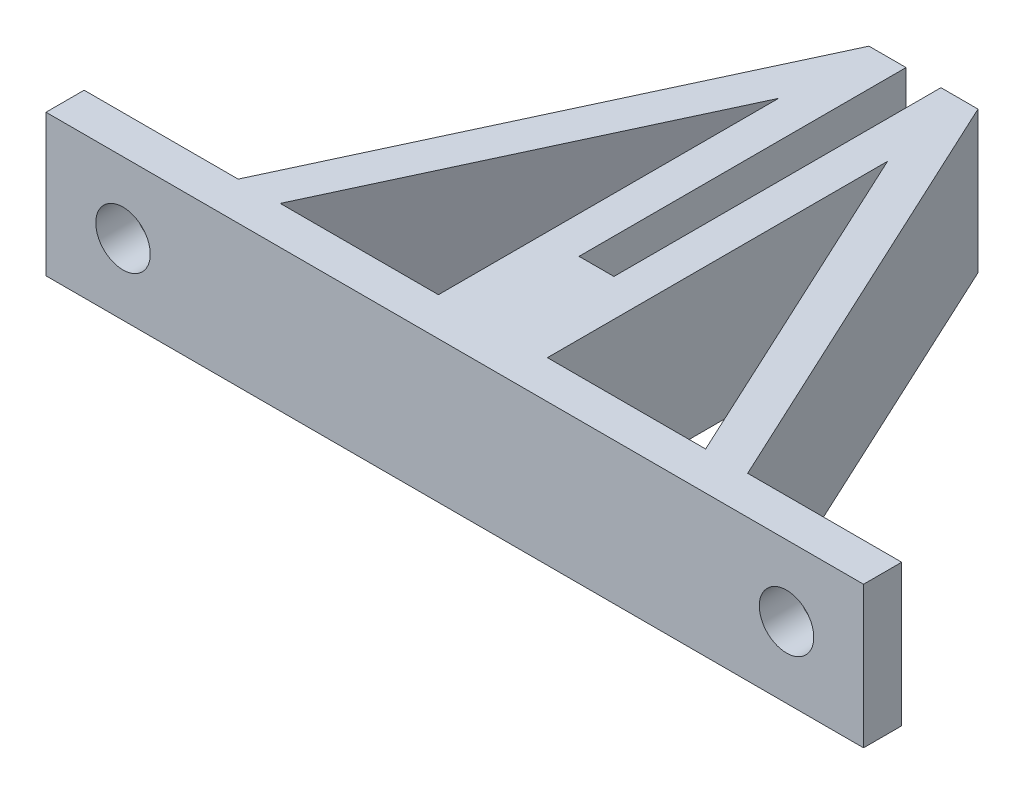
ISO-10303-21;
HEADER;
FILE_DESCRIPTION(('STEP AP214'),'2;1');
FILE_NAME('part.step','',(''),(''),'','','');
FILE_SCHEMA(('AUTOMOTIVE_DESIGN { 1 0 10303 214 1 1 1 1 }'));
ENDSEC;
DATA;
#1=APPLICATION_CONTEXT('core data for automotive mechanical design processes');
#2=APPLICATION_PROTOCOL_DEFINITION('international standard','automotive_design',2000,#1);
#3=PRODUCT_CONTEXT('',#1,'mechanical');
#4=PRODUCT('Part','Part','',(#3));
#5=PRODUCT_RELATED_PRODUCT_CATEGORY('part','',(#4));
#6=PRODUCT_DEFINITION_FORMATION('','',#4);
#7=PRODUCT_DEFINITION_CONTEXT('part definition',#1,'design');
#8=PRODUCT_DEFINITION('design','',#6,#7);
#9=PRODUCT_DEFINITION_SHAPE('','',#8);
#10=(LENGTH_UNIT() NAMED_UNIT(*) SI_UNIT(.MILLI.,.METRE.));
#11=(NAMED_UNIT(*) PLANE_ANGLE_UNIT() SI_UNIT($,.RADIAN.));
#12=(NAMED_UNIT(*) SI_UNIT($,.STERADIAN.) SOLID_ANGLE_UNIT());
#13=UNCERTAINTY_MEASURE_WITH_UNIT(LENGTH_MEASURE(1.E-05),#10,'distance_accuracy_value','');
#14=(GEOMETRIC_REPRESENTATION_CONTEXT(3) GLOBAL_UNCERTAINTY_ASSIGNED_CONTEXT((#13)) GLOBAL_UNIT_ASSIGNED_CONTEXT((#10,
#11,#12)) REPRESENTATION_CONTEXT('',''));
#15=CARTESIAN_POINT('',(0.,0.,0.));
#16=DIRECTION('',(0.,0.,1.));
#17=DIRECTION('',(1.,0.,0.));
#18=AXIS2_PLACEMENT_3D('',#15,#16,#17);
#19=CARTESIAN_POINT('',(-5.59907834101384,13.,0.));
#20=DIRECTION('',(1.,0.,0.));
#21=DIRECTION('',(0.,0.,-1.));
#22=AXIS2_PLACEMENT_3D('',#19,#20,#21);
#23=PLANE('',#22);
#24=DIRECTION('',(0.,0.,1.));
#25=VECTOR('',#24,1.);
#26=CARTESIAN_POINT('',(-5.59907834101384,0.,0.));
#27=LINE('',#26,#25);
#28=CARTESIAN_POINT('',(-5.59907834101385,0.,-7.22390748368882));
#29=VERTEX_POINT('',#28);
#30=CARTESIAN_POINT('',(-5.59907834101384,0.,23.9769585253456));
#31=VERTEX_POINT('',#30);
#32=EDGE_CURVE('E258',#29,#31,#27,.T.);
#33=ORIENTED_EDGE('',*,*,#32,.T.);
#34=DIRECTION('',(0.,-1.,0.));
#35=VECTOR('',#34,1.);
#36=CARTESIAN_POINT('',(-5.59907834101384,13.,23.9769585253456));
#37=LINE('',#36,#35);
#38=CARTESIAN_POINT('',(-5.59907834101384,13.,23.9769585253456));
#39=VERTEX_POINT('',#38);
#40=EDGE_CURVE('E11',#39,#31,#37,.T.);
#41=ORIENTED_EDGE('',*,*,#40,.F.);
#42=DIRECTION('',(0.,0.,1.));
#43=VECTOR('',#42,1.);
#44=CARTESIAN_POINT('',(-5.59907834101384,13.,0.));
#45=LINE('',#44,#43);
#46=CARTESIAN_POINT('',(-5.59907834101385,13.,-7.22390748368882));
#47=VERTEX_POINT('',#46);
#48=EDGE_CURVE('E223',#47,#39,#45,.T.);
#49=ORIENTED_EDGE('',*,*,#48,.F.);
#50=DIRECTION('',(0.,-1.,0.));
#51=VECTOR('',#50,1.);
#52=CARTESIAN_POINT('',(-5.59907834101385,13.,-7.22390748368882));
#53=LINE('',#52,#51);
#54=EDGE_CURVE('E261',#47,#29,#53,.T.);
#55=ORIENTED_EDGE('',*,*,#54,.T.);
#56=EDGE_LOOP('',(#33,#41,#49,#55));
#57=FACE_BOUND('',#56,.T.);
#58=ADVANCED_FACE('F35',(#57),#23,.F.);
#59=CARTESIAN_POINT('',(0.,13.,23.9769585253456));
#60=DIRECTION('',(0.,0.,-1.));
#61=DIRECTION('',(-1.,0.,0.));
#62=AXIS2_PLACEMENT_3D('',#59,#60,#61);
#63=PLANE('',#62);
#64=DIRECTION('',(1.,0.,0.));
#65=VECTOR('',#64,1.);
#66=CARTESIAN_POINT('',(0.,0.,23.9769585253456));
#67=LINE('',#66,#65);
#68=CARTESIAN_POINT('',(-20.1111090428903,0.,23.9769585253456));
#69=VERTEX_POINT('',#68);
#70=EDGE_CURVE('E182',#69,#31,#67,.T.);
#71=ORIENTED_EDGE('',*,*,#70,.F.);
#72=DIRECTION('',(0.,-1.,0.));
#73=VECTOR('',#72,1.);
#74=CARTESIAN_POINT('',(-20.1111090428903,13.,23.9769585253456));
#75=LINE('',#74,#73);
#76=CARTESIAN_POINT('',(-20.1111090428903,13.,23.9769585253456));
#77=VERTEX_POINT('',#76);
#78=EDGE_CURVE('E44',#77,#69,#75,.T.);
#79=ORIENTED_EDGE('',*,*,#78,.F.);
#80=DIRECTION('',(1.,0.,0.));
#81=VECTOR('',#80,1.);
#82=CARTESIAN_POINT('',(0.,13.,23.9769585253456));
#83=LINE('',#82,#81);
#84=EDGE_CURVE('E224',#77,#39,#83,.T.);
#85=ORIENTED_EDGE('',*,*,#84,.T.);
#86=ORIENTED_EDGE('',*,*,#40,.T.);
#87=EDGE_LOOP('',(#71,#79,#85,#86));
#88=FACE_BOUND('',#87,.T.);
#89=ADVANCED_FACE('F319',(#88),#63,.T.);
#90=CARTESIAN_POINT('',(-38.0990783410138,13.,0.));
#91=DIRECTION('',(-1.,0.,0.));
#92=DIRECTION('',(0.,0.,1.));
#93=AXIS2_PLACEMENT_3D('',#90,#91,#92);
#94=PLANE('',#93);
#95=DIRECTION('',(0.,0.,-1.));
#96=VECTOR('',#95,1.);
#97=CARTESIAN_POINT('',(-38.0990783410138,0.,0.));
#98=LINE('',#97,#96);
#99=CARTESIAN_POINT('',(-38.0990783410138,0.,27.4769585253456));
#100=VERTEX_POINT('',#99);
#101=CARTESIAN_POINT('',(-38.0990783410138,0.,23.9769585253456));
#102=VERTEX_POINT('',#101);
#103=EDGE_CURVE('E235',#100,#102,#98,.T.);
#104=ORIENTED_EDGE('',*,*,#103,.F.);
#105=DIRECTION('',(0.,-1.,0.));
#106=VECTOR('',#105,1.);
#107=CARTESIAN_POINT('',(-38.0990783410138,13.,27.4769585253456));
#108=LINE('',#107,#106);
#109=CARTESIAN_POINT('',(-38.0990783410138,13.,27.4769585253456));
#110=VERTEX_POINT('',#109);
#111=EDGE_CURVE('E264',#110,#100,#108,.T.);
#112=ORIENTED_EDGE('',*,*,#111,.F.);
#113=DIRECTION('',(0.,0.,-1.));
#114=VECTOR('',#113,1.);
#115=CARTESIAN_POINT('',(-38.0990783410138,13.,0.));
#116=LINE('',#115,#114);
#117=CARTESIAN_POINT('',(-38.0990783410138,13.,23.9769585253456));
#118=VERTEX_POINT('',#117);
#119=EDGE_CURVE('E189',#110,#118,#116,.T.);
#120=ORIENTED_EDGE('',*,*,#119,.T.);
#121=DIRECTION('',(0.,-1.,0.));
#122=VECTOR('',#121,1.);
#123=CARTESIAN_POINT('',(-38.0990783410138,13.,23.9769585253456));
#124=LINE('',#123,#122);
#125=EDGE_CURVE('E167',#118,#102,#124,.T.);
#126=ORIENTED_EDGE('',*,*,#125,.T.);
#127=EDGE_LOOP('',(#104,#112,#120,#126));
#128=FACE_BOUND('',#127,.T.);
#129=ADVANCED_FACE('F333',(#128),#94,.T.);
#130=CARTESIAN_POINT('',(0.,13.,27.4769585253456));
#131=DIRECTION('',(0.,0.,-1.));
#132=DIRECTION('',(-1.,0.,0.));
#133=AXIS2_PLACEMENT_3D('',#130,#131,#132);
#134=PLANE('',#133);
#135=CARTESIAN_POINT('',(29.8369681706141,6.5,27.4769585253456));
#136=DIRECTION('',(0.,0.,-1.));
#137=DIRECTION('',(-1.,0.,0.));
#138=AXIS2_PLACEMENT_3D('',#135,#136,#137);
#139=CIRCLE('',#138,2.5);
#140=CARTESIAN_POINT('',(27.3369681706141,6.5,27.4769585253456));
#141=VERTEX_POINT('',#140);
#142=EDGE_CURVE('E578',#141,#141,#139,.T.);
#143=ORIENTED_EDGE('',*,*,#142,.T.);
#144=EDGE_LOOP('',(#143));
#145=FACE_BOUND('',#144,.T.);
#146=CARTESIAN_POINT('',(-31.0351248526418,6.5,27.4769585253456));
#147=DIRECTION('',(0.,0.,-1.));
#148=DIRECTION('',(-1.,0.,0.));
#149=AXIS2_PLACEMENT_3D('',#146,#147,#148);
#150=CIRCLE('',#149,2.5);
#151=CARTESIAN_POINT('',(-33.5351248526418,6.5,27.4769585253456));
#152=VERTEX_POINT('',#151);
#153=EDGE_CURVE('E582',#152,#152,#150,.T.);
#154=ORIENTED_EDGE('',*,*,#153,.T.);
#155=EDGE_LOOP('',(#154));
#156=FACE_BOUND('',#155,.T.);
#157=DIRECTION('',(1.,0.,0.));
#158=VECTOR('',#157,1.);
#159=CARTESIAN_POINT('',(0.,0.,27.4769585253456));
#160=LINE('',#159,#158);
#161=CARTESIAN_POINT('',(36.9009216589862,0.,27.4769585253456));
#162=VERTEX_POINT('',#161);
#163=EDGE_CURVE('E238',#100,#162,#160,.T.);
#164=ORIENTED_EDGE('',*,*,#163,.T.);
#165=DIRECTION('',(0.,-1.,0.));
#166=VECTOR('',#165,1.);
#167=CARTESIAN_POINT('',(36.9009216589862,13.,27.4769585253456));
#168=LINE('',#167,#166);
#169=CARTESIAN_POINT('',(36.9009216589862,13.,27.4769585253456));
#170=VERTEX_POINT('',#169);
#171=EDGE_CURVE('E288',#170,#162,#168,.T.);
#172=ORIENTED_EDGE('',*,*,#171,.F.);
#173=DIRECTION('',(1.,0.,0.));
#174=VECTOR('',#173,1.);
#175=CARTESIAN_POINT('',(0.,13.,27.4769585253456));
#176=LINE('',#175,#174);
#177=EDGE_CURVE('E192',#110,#170,#176,.T.);
#178=ORIENTED_EDGE('',*,*,#177,.F.);
#179=ORIENTED_EDGE('',*,*,#111,.T.);
#180=EDGE_LOOP('',(#164,#172,#178,#179));
#181=FACE_BOUND('',#180,.T.);
#182=ADVANCED_FACE('F367',(#145,#156,#181),#134,.F.);
#183=CARTESIAN_POINT('',(36.9009216589862,13.,0.));
#184=DIRECTION('',(-1.,0.,0.));
#185=DIRECTION('',(0.,0.,1.));
#186=AXIS2_PLACEMENT_3D('',#183,#184,#185);
#187=PLANE('',#186);
#188=DIRECTION('',(0.,0.,-1.));
#189=VECTOR('',#188,1.);
#190=CARTESIAN_POINT('',(36.9009216589862,0.,0.));
#191=LINE('',#190,#189);
#192=CARTESIAN_POINT('',(36.9009216589862,0.,23.9769585253456));
#193=VERTEX_POINT('',#192);
#194=EDGE_CURVE('E241',#162,#193,#191,.T.);
#195=ORIENTED_EDGE('',*,*,#194,.T.);
#196=DIRECTION('',(0.,-1.,0.));
#197=VECTOR('',#196,1.);
#198=CARTESIAN_POINT('',(36.9009216589862,13.,23.9769585253456));
#199=LINE('',#198,#197);
#200=CARTESIAN_POINT('',(36.9009216589862,13.,23.9769585253456));
#201=VERTEX_POINT('',#200);
#202=EDGE_CURVE('E285',#201,#193,#199,.T.);
#203=ORIENTED_EDGE('',*,*,#202,.F.);
#204=DIRECTION('',(0.,0.,-1.));
#205=VECTOR('',#204,1.);
#206=CARTESIAN_POINT('',(36.9009216589862,13.,0.));
#207=LINE('',#206,#205);
#208=EDGE_CURVE('E195',#170,#201,#207,.T.);
#209=ORIENTED_EDGE('',*,*,#208,.F.);
#210=ORIENTED_EDGE('',*,*,#171,.T.);
#211=EDGE_LOOP('',(#195,#203,#209,#210));
#212=FACE_BOUND('',#211,.T.);
#213=ADVANCED_FACE('F363',(#212),#187,.F.);
#214=CARTESIAN_POINT('',(0.,13.,23.9769585253456));
#215=DIRECTION('',(0.,0.,1.));
#216=DIRECTION('',(1.,0.,0.));
#217=AXIS2_PLACEMENT_3D('',#214,#215,#216);
#218=PLANE('',#217);
#219=CARTESIAN_POINT('',(29.8369681706141,6.5,23.9769585253456));
#220=DIRECTION('',(0.,0.,-1.));
#221=DIRECTION('',(-1.,0.,0.));
#222=AXIS2_PLACEMENT_3D('',#219,#220,#221);
#223=CIRCLE('',#222,2.5);
#224=CARTESIAN_POINT('',(27.3369681706141,6.5,23.9769585253456));
#225=VERTEX_POINT('',#224);
#226=EDGE_CURVE('E575',#225,#225,#223,.T.);
#227=ORIENTED_EDGE('',*,*,#226,.F.);
#228=EDGE_LOOP('',(#227));
#229=FACE_BOUND('',#228,.T.);
#230=DIRECTION('',(-1.,0.,0.));
#231=VECTOR('',#230,1.);
#232=CARTESIAN_POINT('',(0.,0.,23.9769585253456));
#233=LINE('',#232,#231);
#234=CARTESIAN_POINT('',(22.773014682242,0.,23.9769585253456));
#235=VERTEX_POINT('',#234);
#236=EDGE_CURVE('E244',#193,#235,#233,.T.);
#237=ORIENTED_EDGE('',*,*,#236,.T.);
#238=DIRECTION('',(0.,-1.,0.));
#239=VECTOR('',#238,1.);
#240=CARTESIAN_POINT('',(22.773014682242,13.,23.9769585253456));
#241=LINE('',#240,#239);
#242=CARTESIAN_POINT('',(22.773014682242,13.,23.9769585253456));
#243=VERTEX_POINT('',#242);
#244=EDGE_CURVE('E283',#243,#235,#241,.T.);
#245=ORIENTED_EDGE('',*,*,#244,.F.);
#246=DIRECTION('',(-1.,0.,0.));
#247=VECTOR('',#246,1.);
#248=CARTESIAN_POINT('',(0.,13.,23.9769585253456));
#249=LINE('',#248,#247);
#250=EDGE_CURVE('E198',#201,#243,#249,.T.);
#251=ORIENTED_EDGE('',*,*,#250,.F.);
#252=ORIENTED_EDGE('',*,*,#202,.T.);
#253=EDGE_LOOP('',(#237,#245,#251,#252));
#254=FACE_BOUND('',#253,.T.);
#255=ADVANCED_FACE('F359',(#229,#254),#218,.F.);
#256=CARTESIAN_POINT('',(9.5540772857573,13.,-4.44375687709642));
#257=DIRECTION('',(0.906721111888507,0.,-0.421730749715585));
#258=DIRECTION('',(-0.421730749715585,0.,-0.906721111888507));
#259=AXIS2_PLACEMENT_3D('',#256,#257,#258);
#260=PLANE('',#259);
#261=DIRECTION('',(0.421730749715585,0.,0.906721111888507));
#262=VECTOR('',#261,1.);
#263=CARTESIAN_POINT('',(9.5540772857573,0.,-4.44375687709642));
#264=LINE('',#263,#262);
#265=CARTESIAN_POINT('',(4.40092165898615,0.,-15.5230414746544));
#266=VERTEX_POINT('',#265);
#267=EDGE_CURVE('E247',#266,#235,#264,.T.);
#268=ORIENTED_EDGE('',*,*,#267,.F.);
#269=DIRECTION('',(0.,-1.,0.));
#270=VECTOR('',#269,1.);
#271=CARTESIAN_POINT('',(4.40092165898615,13.,-15.5230414746544));
#272=LINE('',#271,#270);
#273=CARTESIAN_POINT('',(4.40092165898615,13.,-15.5230414746544));
#274=VERTEX_POINT('',#273);
#275=EDGE_CURVE('E280',#274,#266,#272,.T.);
#276=ORIENTED_EDGE('',*,*,#275,.F.);
#277=DIRECTION('',(0.421730749715585,0.,0.906721111888507));
#278=VECTOR('',#277,1.);
#279=CARTESIAN_POINT('',(9.5540772857573,13.,-4.44375687709642));
#280=LINE('',#279,#278);
#281=EDGE_CURVE('E200',#274,#243,#280,.T.);
#282=ORIENTED_EDGE('',*,*,#281,.T.);
#283=ORIENTED_EDGE('',*,*,#244,.T.);
#284=EDGE_LOOP('',(#268,#276,#282,#283));
#285=FACE_BOUND('',#284,.T.);
#286=ADVANCED_FACE('F356',(#285),#260,.T.);
#287=CARTESIAN_POINT('',(1.00092165898615,13.,0.));
#288=DIRECTION('',(1.,0.,0.));
#289=DIRECTION('',(0.,0.,-1.));
#290=AXIS2_PLACEMENT_3D('',#287,#288,#289);
#291=PLANE('',#290);
#292=DIRECTION('',(0.,-1.,0.));
#293=VECTOR('',#292,1.);
#294=CARTESIAN_POINT('',(1.00092165898615,13.,-15.5230414746544));
#295=LINE('',#294,#293);
#296=CARTESIAN_POINT('',(1.00092165898615,13.,-15.5230414746544));
#297=VERTEX_POINT('',#296);
#298=CARTESIAN_POINT('',(1.00092165898615,7.,-15.5230414746544));
#299=VERTEX_POINT('',#298);
#300=EDGE_CURVE('E52',#297,#299,#295,.T.);
#301=ORIENTED_EDGE('',*,*,#300,.T.);
#302=DIRECTION('',(0.,0.,1.));
#303=VECTOR('',#302,1.);
#304=CARTESIAN_POINT('',(1.00092165898615,7.,0.));
#305=LINE('',#304,#303);
#306=CARTESIAN_POINT('',(1.00092165898615,7.,14.4769585253456));
#307=VERTEX_POINT('',#306);
#308=EDGE_CURVE('E56',#299,#307,#305,.T.);
#309=ORIENTED_EDGE('',*,*,#308,.T.);
#310=DIRECTION('',(0.,-1.,0.));
#311=VECTOR('',#310,1.);
#312=CARTESIAN_POINT('',(1.00092165898615,13.,14.4769585253456));
#313=LINE('',#312,#311);
#314=CARTESIAN_POINT('',(1.00092165898615,13.,14.4769585253456));
#315=VERTEX_POINT('',#314);
#316=EDGE_CURVE('E277',#315,#307,#313,.T.);
#317=ORIENTED_EDGE('',*,*,#316,.F.);
#318=DIRECTION('',(0.,0.,1.));
#319=VECTOR('',#318,1.);
#320=CARTESIAN_POINT('',(1.00092165898615,13.,0.));
#321=LINE('',#320,#319);
#322=EDGE_CURVE('E206',#297,#315,#321,.T.);
#323=ORIENTED_EDGE('',*,*,#322,.F.);
#324=EDGE_LOOP('',(#301,#309,#317,#323));
#325=FACE_BOUND('',#324,.T.);
#326=ADVANCED_FACE('F352',(#325),#291,.F.);
#327=CARTESIAN_POINT('',(0.,13.,14.4769585253456));
#328=DIRECTION('',(0.,0.,-1.));
#329=DIRECTION('',(-1.,0.,0.));
#330=AXIS2_PLACEMENT_3D('',#327,#328,#329);
#331=PLANE('',#330);
#332=DIRECTION('',(1.,0.,0.));
#333=VECTOR('',#332,1.);
#334=CARTESIAN_POINT('',(0.,7.,14.4769585253456));
#335=LINE('',#334,#333);
#336=CARTESIAN_POINT('',(-2.19907834101384,7.,14.4769585253456));
#337=VERTEX_POINT('',#336);
#338=EDGE_CURVE('E591',#337,#307,#335,.T.);
#339=ORIENTED_EDGE('',*,*,#338,.F.);
#340=DIRECTION('',(0.,-1.,0.));
#341=VECTOR('',#340,1.);
#342=CARTESIAN_POINT('',(-2.19907834101384,13.,14.4769585253456));
#343=LINE('',#342,#341);
#344=CARTESIAN_POINT('',(-2.19907834101384,13.,14.4769585253456));
#345=VERTEX_POINT('',#344);
#346=EDGE_CURVE('E274',#345,#337,#343,.T.);
#347=ORIENTED_EDGE('',*,*,#346,.F.);
#348=DIRECTION('',(1.,0.,0.));
#349=VECTOR('',#348,1.);
#350=CARTESIAN_POINT('',(0.,13.,14.4769585253456));
#351=LINE('',#350,#349);
#352=EDGE_CURVE('E208',#345,#315,#351,.T.);
#353=ORIENTED_EDGE('',*,*,#352,.T.);
#354=ORIENTED_EDGE('',*,*,#316,.T.);
#355=EDGE_LOOP('',(#339,#347,#353,#354));
#356=FACE_BOUND('',#355,.T.);
#357=ADVANCED_FACE('F348',(#356),#331,.T.);
#358=CARTESIAN_POINT('',(-2.19907834101384,13.,0.));
#359=DIRECTION('',(1.,0.,0.));
#360=DIRECTION('',(0.,0.,-1.));
#361=AXIS2_PLACEMENT_3D('',#358,#359,#360);
#362=PLANE('',#361);
#363=DIRECTION('',(0.,0.,1.));
#364=VECTOR('',#363,1.);
#365=CARTESIAN_POINT('',(-2.19907834101384,7.,0.));
#366=LINE('',#365,#364);
#367=CARTESIAN_POINT('',(-2.19907834101384,7.,-15.5230414746544));
#368=VERTEX_POINT('',#367);
#369=EDGE_CURVE('E588',#368,#337,#366,.T.);
#370=ORIENTED_EDGE('',*,*,#369,.F.);
#371=DIRECTION('',(0.,-1.,0.));
#372=VECTOR('',#371,1.);
#373=CARTESIAN_POINT('',(-2.19907834101384,13.,-15.5230414746544));
#374=LINE('',#373,#372);
#375=CARTESIAN_POINT('',(-2.19907834101384,13.,-15.5230414746544));
#376=VERTEX_POINT('',#375);
#377=EDGE_CURVE('E271',#376,#368,#374,.T.);
#378=ORIENTED_EDGE('',*,*,#377,.F.);
#379=DIRECTION('',(0.,0.,1.));
#380=VECTOR('',#379,1.);
#381=CARTESIAN_POINT('',(-2.19907834101384,13.,0.));
#382=LINE('',#381,#380);
#383=EDGE_CURVE('E211',#376,#345,#382,.T.);
#384=ORIENTED_EDGE('',*,*,#383,.T.);
#385=ORIENTED_EDGE('',*,*,#346,.T.);
#386=EDGE_LOOP('',(#370,#378,#384,#385));
#387=FACE_BOUND('',#386,.T.);
#388=ADVANCED_FACE('F344',(#387),#362,.T.);
#389=CARTESIAN_POINT('',(0.,13.,-15.5230414746544));
#390=DIRECTION('',(0.,0.,-1.));
#391=DIRECTION('',(-1.,0.,0.));
#392=AXIS2_PLACEMENT_3D('',#389,#390,#391);
#393=PLANE('',#392);
#394=DIRECTION('',(1.,0.,0.));
#395=VECTOR('',#394,1.);
#396=CARTESIAN_POINT('',(0.,0.,-15.5230414746544));
#397=LINE('',#396,#395);
#398=CARTESIAN_POINT('',(-5.59907834101385,0.,-15.5230414746544));
#399=VERTEX_POINT('',#398);
#400=EDGE_CURVE('E250',#399,#266,#397,.T.);
#401=ORIENTED_EDGE('',*,*,#400,.F.);
#402=DIRECTION('',(0.,-1.,0.));
#403=VECTOR('',#402,1.);
#404=CARTESIAN_POINT('',(-5.59907834101385,13.,-15.5230414746544));
#405=LINE('',#404,#403);
#406=CARTESIAN_POINT('',(-5.59907834101385,13.,-15.5230414746544));
#407=VERTEX_POINT('',#406);
#408=EDGE_CURVE('E269',#407,#399,#405,.T.);
#409=ORIENTED_EDGE('',*,*,#408,.F.);
#410=DIRECTION('',(1.,0.,0.));
#411=VECTOR('',#410,1.);
#412=CARTESIAN_POINT('',(0.,13.,-15.5230414746544));
#413=LINE('',#412,#411);
#414=EDGE_CURVE('E214',#407,#376,#413,.T.);
#415=ORIENTED_EDGE('',*,*,#414,.T.);
#416=ORIENTED_EDGE('',*,*,#377,.T.);
#417=DIRECTION('',(1.,0.,0.));
#418=VECTOR('',#417,1.);
#419=CARTESIAN_POINT('',(0.,7.,-15.5230414746544));
#420=LINE('',#419,#418);
#421=EDGE_CURVE('E185',#368,#299,#420,.T.);
#422=ORIENTED_EDGE('',*,*,#421,.T.);
#423=ORIENTED_EDGE('',*,*,#300,.F.);
#424=DIRECTION('',(1.,0.,0.));
#425=VECTOR('',#424,1.);
#426=CARTESIAN_POINT('',(0.,13.,-15.5230414746544));
#427=LINE('',#426,#425);
#428=EDGE_CURVE('E203',#297,#274,#427,.T.);
#429=ORIENTED_EDGE('',*,*,#428,.T.);
#430=ORIENTED_EDGE('',*,*,#275,.T.);
#431=EDGE_LOOP('',(#401,#409,#415,#416,#422,#423,#429,#430));
#432=FACE_BOUND('',#431,.T.);
#433=ADVANCED_FACE('F340',(#432),#393,.T.);
#434=CARTESIAN_POINT('',(-10.5391336241607,13.,-4.90192261588869));
#435=DIRECTION('',(-0.906721111888507,0.,-0.421730749715585));
#436=DIRECTION('',(-0.421730749715585,0.,0.906721111888507));
#437=AXIS2_PLACEMENT_3D('',#434,#435,#436);
#438=PLANE('',#437);
#439=DIRECTION('',(0.421730749715585,0.,-0.906721111888507));
#440=VECTOR('',#439,1.);
#441=CARTESIAN_POINT('',(-10.5391336241607,0.,-4.90192261588869));
#442=LINE('',#441,#440);
#443=CARTESIAN_POINT('',(-23.9711713642697,0.,23.9769585253456));
#444=VERTEX_POINT('',#443);
#445=EDGE_CURVE('E252',#444,#399,#442,.T.);
#446=ORIENTED_EDGE('',*,*,#445,.F.);
#447=DIRECTION('',(0.,-1.,0.));
#448=VECTOR('',#447,1.);
#449=CARTESIAN_POINT('',(-23.9711713642697,13.,23.9769585253456));
#450=LINE('',#449,#448);
#451=CARTESIAN_POINT('',(-23.9711713642697,13.,23.9769585253456));
#452=VERTEX_POINT('',#451);
#453=EDGE_CURVE('E267',#452,#444,#450,.T.);
#454=ORIENTED_EDGE('',*,*,#453,.F.);
#455=DIRECTION('',(0.421730749715585,0.,-0.906721111888507));
#456=VECTOR('',#455,1.);
#457=CARTESIAN_POINT('',(-10.5391336241607,13.,-4.90192261588869));
#458=LINE('',#457,#456);
#459=EDGE_CURVE('E217',#452,#407,#458,.T.);
#460=ORIENTED_EDGE('',*,*,#459,.T.);
#461=ORIENTED_EDGE('',*,*,#408,.T.);
#462=EDGE_LOOP('',(#446,#454,#460,#461));
#463=FACE_BOUND('',#462,.T.);
#464=ADVANCED_FACE('F337',(#463),#438,.T.);
#465=CARTESIAN_POINT('',(4.40092165898616,13.,0.));
#466=DIRECTION('',(1.,0.,0.));
#467=DIRECTION('',(0.,0.,-1.));
#468=AXIS2_PLACEMENT_3D('',#465,#466,#467);
#469=PLANE('',#468);
#470=DIRECTION('',(0.,0.,1.));
#471=VECTOR('',#470,1.);
#472=CARTESIAN_POINT('',(4.40092165898616,0.,0.));
#473=LINE('',#472,#471);
#474=CARTESIAN_POINT('',(4.40092165898616,0.,-7.2239074836888));
#475=VERTEX_POINT('',#474);
#476=CARTESIAN_POINT('',(4.40092165898616,0.,23.9769585253456));
#477=VERTEX_POINT('',#476);
#478=EDGE_CURVE('E164',#475,#477,#473,.T.);
#479=ORIENTED_EDGE('',*,*,#478,.F.);
#480=DIRECTION('',(0.,-1.,0.));
#481=VECTOR('',#480,1.);
#482=CARTESIAN_POINT('',(4.40092165898616,13.,-7.2239074836888));
#483=LINE('',#482,#481);
#484=CARTESIAN_POINT('',(4.40092165898616,13.,-7.2239074836888));
#485=VERTEX_POINT('',#484);
#486=EDGE_CURVE('E39',#485,#475,#483,.T.);
#487=ORIENTED_EDGE('',*,*,#486,.F.);
#488=DIRECTION('',(0.,0.,1.));
#489=VECTOR('',#488,1.);
#490=CARTESIAN_POINT('',(4.40092165898616,13.,0.));
#491=LINE('',#490,#489);
#492=CARTESIAN_POINT('',(4.40092165898616,13.,23.9769585253456));
#493=VERTEX_POINT('',#492);
#494=EDGE_CURVE('E162',#485,#493,#491,.T.);
#495=ORIENTED_EDGE('',*,*,#494,.T.);
#496=DIRECTION('',(0.,-1.,0.));
#497=VECTOR('',#496,1.);
#498=CARTESIAN_POINT('',(4.40092165898616,13.,23.9769585253456));
#499=LINE('',#498,#497);
#500=EDGE_CURVE('E228',#493,#477,#499,.T.);
#501=ORIENTED_EDGE('',*,*,#500,.T.);
#502=EDGE_LOOP('',(#479,#487,#495,#501));
#503=FACE_BOUND('',#502,.T.);
#504=ADVANCED_FACE('F37',(#503),#469,.T.);
#505=CARTESIAN_POINT('',(6.38055339414752,13.,-2.96769925309187));
#506=DIRECTION('',(0.906721111888507,0.,-0.421730749715585));
#507=DIRECTION('',(-0.421730749715585,0.,-0.906721111888507));
#508=AXIS2_PLACEMENT_3D('',#505,#506,#507);
#509=PLANE('',#508);
#510=DIRECTION('',(0.421730749715585,0.,0.906721111888507));
#511=VECTOR('',#510,1.);
#512=CARTESIAN_POINT('',(6.38055339414752,0.,-2.96769925309187));
#513=LINE('',#512,#511);
#514=CARTESIAN_POINT('',(18.9129523608626,0.,23.9769585253456));
#515=VERTEX_POINT('',#514);
#516=EDGE_CURVE('E230',#475,#515,#513,.T.);
#517=ORIENTED_EDGE('',*,*,#516,.T.);
#518=DIRECTION('',(0.,-1.,0.));
#519=VECTOR('',#518,1.);
#520=CARTESIAN_POINT('',(18.9129523608626,13.,23.9769585253456));
#521=LINE('',#520,#519);
#522=CARTESIAN_POINT('',(18.9129523608626,13.,23.9769585253456));
#523=VERTEX_POINT('',#522);
#524=EDGE_CURVE('E168',#523,#515,#521,.T.);
#525=ORIENTED_EDGE('',*,*,#524,.F.);
#526=DIRECTION('',(0.421730749715585,0.,0.906721111888507));
#527=VECTOR('',#526,1.);
#528=CARTESIAN_POINT('',(6.38055339414752,13.,-2.96769925309187));
#529=LINE('',#528,#527);
#530=EDGE_CURVE('E170',#485,#523,#529,.T.);
#531=ORIENTED_EDGE('',*,*,#530,.F.);
#532=ORIENTED_EDGE('',*,*,#486,.T.);
#533=EDGE_LOOP('',(#517,#525,#531,#532));
#534=FACE_BOUND('',#533,.T.);
#535=ADVANCED_FACE('F171',(#534),#509,.F.);
#536=CARTESIAN_POINT('',(-31.0351248526418,6.5,23.9769585253456));
#537=DIRECTION('',(0.,0.,-1.));
#538=DIRECTION('',(-1.,0.,0.));
#539=AXIS2_PLACEMENT_3D('',#536,#537,#538);
#540=CIRCLE('',#539,2.5);
#541=CARTESIAN_POINT('',(-33.5351248526418,6.5,23.9769585253456));
#542=VERTEX_POINT('',#541);
#543=EDGE_CURVE('E579',#542,#542,#540,.T.);
#544=ORIENTED_EDGE('',*,*,#543,.F.);
#545=EDGE_LOOP('',(#544));
#546=FACE_BOUND('',#545,.T.);
#547=EDGE_CURVE('E255',#102,#444,#67,.T.);
#548=ORIENTED_EDGE('',*,*,#547,.F.);
#549=ORIENTED_EDGE('',*,*,#125,.F.);
#550=EDGE_CURVE('E220',#118,#452,#83,.T.);
#551=ORIENTED_EDGE('',*,*,#550,.T.);
#552=ORIENTED_EDGE('',*,*,#453,.T.);
#553=EDGE_LOOP('',(#548,#549,#551,#552));
#554=FACE_BOUND('',#553,.T.);
#555=ADVANCED_FACE('F335',(#546,#554),#63,.T.);
#556=CARTESIAN_POINT('',(0.,13.,23.9769585253456));
#557=DIRECTION('',(0.,0.,1.));
#558=DIRECTION('',(1.,0.,0.));
#559=AXIS2_PLACEMENT_3D('',#556,#557,#558);
#560=PLANE('',#559);
#561=DIRECTION('',(-1.,0.,0.));
#562=VECTOR('',#561,1.);
#563=CARTESIAN_POINT('',(0.,0.,23.9769585253456));
#564=LINE('',#563,#562);
#565=EDGE_CURVE('E232',#515,#477,#564,.T.);
#566=ORIENTED_EDGE('',*,*,#565,.T.);
#567=ORIENTED_EDGE('',*,*,#500,.F.);
#568=DIRECTION('',(-1.,0.,0.));
#569=VECTOR('',#568,1.);
#570=CARTESIAN_POINT('',(0.,13.,23.9769585253456));
#571=LINE('',#570,#569);
#572=EDGE_CURVE('E175',#523,#493,#571,.T.);
#573=ORIENTED_EDGE('',*,*,#572,.F.);
#574=ORIENTED_EDGE('',*,*,#524,.T.);
#575=EDGE_LOOP('',(#566,#567,#573,#574));
#576=FACE_BOUND('',#575,.T.);
#577=ADVANCED_FACE('F294',(#576),#560,.F.);
#578=CARTESIAN_POINT('',(-7.36560973255091,13.,-3.42586499188414));
#579=DIRECTION('',(-0.906721111888507,0.,-0.421730749715584));
#580=DIRECTION('',(-0.421730749715584,0.,0.906721111888507));
#581=AXIS2_PLACEMENT_3D('',#578,#579,#580);
#582=PLANE('',#581);
#583=DIRECTION('',(0.421730749715584,0.,-0.906721111888507));
#584=VECTOR('',#583,1.);
#585=CARTESIAN_POINT('',(-7.36560973255091,0.,-3.42586499188414));
#586=LINE('',#585,#584);
#587=EDGE_CURVE('E180',#69,#29,#586,.T.);
#588=ORIENTED_EDGE('',*,*,#587,.T.);
#589=ORIENTED_EDGE('',*,*,#54,.F.);
#590=DIRECTION('',(0.421730749715584,0.,-0.906721111888507));
#591=VECTOR('',#590,1.);
#592=CARTESIAN_POINT('',(-7.36560973255091,13.,-3.42586499188414));
#593=LINE('',#592,#591);
#594=EDGE_CURVE('E226',#77,#47,#593,.T.);
#595=ORIENTED_EDGE('',*,*,#594,.F.);
#596=ORIENTED_EDGE('',*,*,#78,.T.);
#597=EDGE_LOOP('',(#588,#589,#595,#596));
#598=FACE_BOUND('',#597,.T.);
#599=ADVANCED_FACE('F316',(#598),#582,.F.);
#600=CARTESIAN_POINT('',(0.,13.,0.));
#601=DIRECTION('',(0.,1.,0.));
#602=DIRECTION('',(0.,0.,1.));
#603=AXIS2_PLACEMENT_3D('',#600,#601,#602);
#604=PLANE('',#603);
#605=ORIENTED_EDGE('',*,*,#494,.F.);
#606=ORIENTED_EDGE('',*,*,#530,.T.);
#607=ORIENTED_EDGE('',*,*,#572,.T.);
#608=EDGE_LOOP('',(#605,#606,#607));
#609=FACE_BOUND('',#608,.T.);
#610=ORIENTED_EDGE('',*,*,#119,.F.);
#611=ORIENTED_EDGE('',*,*,#177,.T.);
#612=ORIENTED_EDGE('',*,*,#208,.T.);
#613=ORIENTED_EDGE('',*,*,#250,.T.);
#614=ORIENTED_EDGE('',*,*,#281,.F.);
#615=ORIENTED_EDGE('',*,*,#428,.F.);
#616=ORIENTED_EDGE('',*,*,#322,.T.);
#617=ORIENTED_EDGE('',*,*,#352,.F.);
#618=ORIENTED_EDGE('',*,*,#383,.F.);
#619=ORIENTED_EDGE('',*,*,#414,.F.);
#620=ORIENTED_EDGE('',*,*,#459,.F.);
#621=ORIENTED_EDGE('',*,*,#550,.F.);
#622=EDGE_LOOP('',(#610,#611,#612,#613,#614,#615,#616,#617,#618,#619,#620,#621));
#623=FACE_BOUND('',#622,.T.);
#624=ORIENTED_EDGE('',*,*,#48,.T.);
#625=ORIENTED_EDGE('',*,*,#84,.F.);
#626=ORIENTED_EDGE('',*,*,#594,.T.);
#627=EDGE_LOOP('',(#624,#625,#626));
#628=FACE_BOUND('',#627,.T.);
#629=ADVANCED_FACE('F177',(#609,#623,#628),#604,.T.);
#630=CARTESIAN_POINT('',(0.,0.,0.));
#631=DIRECTION('',(0.,1.,0.));
#632=DIRECTION('',(0.,0.,1.));
#633=AXIS2_PLACEMENT_3D('',#630,#631,#632);
#634=PLANE('',#633);
#635=ORIENTED_EDGE('',*,*,#478,.T.);
#636=ORIENTED_EDGE('',*,*,#565,.F.);
#637=ORIENTED_EDGE('',*,*,#516,.F.);
#638=EDGE_LOOP('',(#635,#636,#637));
#639=FACE_BOUND('',#638,.T.);
#640=ORIENTED_EDGE('',*,*,#103,.T.);
#641=ORIENTED_EDGE('',*,*,#547,.T.);
#642=ORIENTED_EDGE('',*,*,#445,.T.);
#643=ORIENTED_EDGE('',*,*,#400,.T.);
#644=ORIENTED_EDGE('',*,*,#267,.T.);
#645=ORIENTED_EDGE('',*,*,#236,.F.);
#646=ORIENTED_EDGE('',*,*,#194,.F.);
#647=ORIENTED_EDGE('',*,*,#163,.F.);
#648=EDGE_LOOP('',(#640,#641,#642,#643,#644,#645,#646,#647));
#649=FACE_BOUND('',#648,.T.);
#650=ORIENTED_EDGE('',*,*,#32,.F.);
#651=ORIENTED_EDGE('',*,*,#587,.F.);
#652=ORIENTED_EDGE('',*,*,#70,.T.);
#653=EDGE_LOOP('',(#650,#651,#652));
#654=FACE_BOUND('',#653,.T.);
#655=ADVANCED_FACE('F296',(#639,#649,#654),#634,.F.);
#656=CARTESIAN_POINT('',(0.,7.,0.));
#657=DIRECTION('',(0.,1.,0.));
#658=DIRECTION('',(0.,0.,1.));
#659=AXIS2_PLACEMENT_3D('',#656,#657,#658);
#660=PLANE('',#659);
#661=ORIENTED_EDGE('',*,*,#369,.T.);
#662=ORIENTED_EDGE('',*,*,#338,.T.);
#663=ORIENTED_EDGE('',*,*,#308,.F.);
#664=ORIENTED_EDGE('',*,*,#421,.F.);
#665=EDGE_LOOP('',(#661,#662,#663,#664));
#666=FACE_BOUND('',#665,.T.);
#667=ADVANCED_FACE('F299',(#666),#660,.T.);
#668=CARTESIAN_POINT('',(-31.0351248526418,6.5,30.9769585253456));
#669=DIRECTION('',(0.,0.,-1.));
#670=DIRECTION('',(-1.,0.,0.));
#671=AXIS2_PLACEMENT_3D('',#668,#669,#670);
#672=CYLINDRICAL_SURFACE('',#671,2.5);
#673=ORIENTED_EDGE('',*,*,#543,.T.);
#674=EDGE_LOOP('',(#673));
#675=FACE_BOUND('',#674,.T.);
#676=ORIENTED_EDGE('',*,*,#153,.F.);
#677=EDGE_LOOP('',(#676));
#678=FACE_BOUND('',#677,.T.);
#679=ADVANCED_FACE('F550',(#675,#678),#672,.F.);
#680=CARTESIAN_POINT('',(29.8369681706141,6.5,30.9769585253456));
#681=DIRECTION('',(0.,0.,-1.));
#682=DIRECTION('',(-1.,0.,0.));
#683=AXIS2_PLACEMENT_3D('',#680,#681,#682);
#684=CYLINDRICAL_SURFACE('',#683,2.5);
#685=ORIENTED_EDGE('',*,*,#226,.T.);
#686=EDGE_LOOP('',(#685));
#687=FACE_BOUND('',#686,.T.);
#688=ORIENTED_EDGE('',*,*,#142,.F.);
#689=EDGE_LOOP('',(#688));
#690=FACE_BOUND('',#689,.T.);
#691=ADVANCED_FACE('F557',(#687,#690),#684,.F.);
#692=CLOSED_SHELL('',(#58,#89,#129,#182,#213,#255,#286,#326,#357,#388,#433,#464,#504,#535,#555,
#577,#599,#629,#655,#667,#679,#691));
#693=MANIFOLD_SOLID_BREP('B2',#692);
#694=ADVANCED_BREP_SHAPE_REPRESENTATION('',(#18,#693),#14);
#695=SHAPE_DEFINITION_REPRESENTATION(#9,#694);
ENDSEC;
END-ISO-10303-21;
